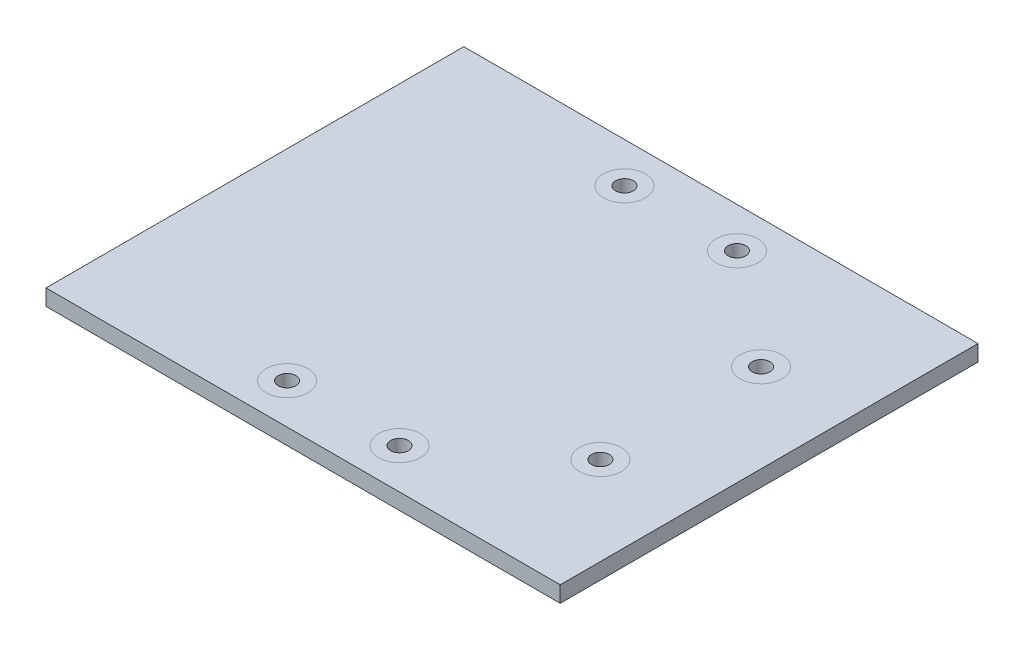
ISO-10303-21;
HEADER;
FILE_DESCRIPTION(('STEP AP214'),'2;1');
FILE_NAME('part.step','',(''),(''),'','','');
FILE_SCHEMA(('AUTOMOTIVE_DESIGN { 1 0 10303 214 1 1 1 1 }'));
ENDSEC;
DATA;
#1=APPLICATION_CONTEXT('core data for automotive mechanical design processes');
#2=APPLICATION_PROTOCOL_DEFINITION('international standard','automotive_design',2000,#1);
#3=PRODUCT_CONTEXT('',#1,'mechanical');
#4=PRODUCT('Part','Part','',(#3));
#5=PRODUCT_RELATED_PRODUCT_CATEGORY('part','',(#4));
#6=PRODUCT_DEFINITION_FORMATION('','',#4);
#7=PRODUCT_DEFINITION_CONTEXT('part definition',#1,'design');
#8=PRODUCT_DEFINITION('design','',#6,#7);
#9=PRODUCT_DEFINITION_SHAPE('','',#8);
#10=(LENGTH_UNIT() NAMED_UNIT(*) SI_UNIT(.MILLI.,.METRE.));
#11=(NAMED_UNIT(*) PLANE_ANGLE_UNIT() SI_UNIT($,.RADIAN.));
#12=(NAMED_UNIT(*) SI_UNIT($,.STERADIAN.) SOLID_ANGLE_UNIT());
#13=UNCERTAINTY_MEASURE_WITH_UNIT(LENGTH_MEASURE(1.E-05),#10,'distance_accuracy_value','');
#14=(GEOMETRIC_REPRESENTATION_CONTEXT(3) GLOBAL_UNCERTAINTY_ASSIGNED_CONTEXT((#13)) GLOBAL_UNIT_ASSIGNED_CONTEXT((#10,
#11,#12)) REPRESENTATION_CONTEXT('',''));
#15=CARTESIAN_POINT('',(0.,0.,0.));
#16=DIRECTION('',(0.,0.,1.));
#17=DIRECTION('',(1.,0.,0.));
#18=AXIS2_PLACEMENT_3D('',#15,#16,#17);
#19=CARTESIAN_POINT('',(16.4933920704846,0.,-34.0264317180617));
#20=DIRECTION('',(0.,1.,0.));
#21=DIRECTION('',(0.,0.,1.));
#22=AXIS2_PLACEMENT_3D('',#19,#20,#21);
#23=PLANE('',#22);
#24=CARTESIAN_POINT('',(53.,0.,-36.));
#25=DIRECTION('',(0.,1.,0.));
#26=DIRECTION('',(0.,0.,1.));
#27=AXIS2_PLACEMENT_3D('',#24,#25,#26);
#28=CIRCLE('',#27,2.6);
#29=CARTESIAN_POINT('',(53.,0.,-33.4));
#30=VERTEX_POINT('',#29);
#31=EDGE_CURVE('E150',#30,#30,#28,.F.);
#32=ORIENTED_EDGE('',*,*,#31,.T.);
#33=EDGE_LOOP('',(#32));
#34=FACE_BOUND('',#33,.T.);
#35=CARTESIAN_POINT('',(25.,0.,-47.));
#36=DIRECTION('',(0.,1.,0.));
#37=DIRECTION('',(0.,0.,1.));
#38=AXIS2_PLACEMENT_3D('',#35,#36,#37);
#39=CIRCLE('',#38,2.59999999999999);
#40=CARTESIAN_POINT('',(25.,0.,-44.4));
#41=VERTEX_POINT('',#40);
#42=EDGE_CURVE('E134',#41,#41,#39,.F.);
#43=ORIENTED_EDGE('',*,*,#42,.T.);
#44=EDGE_LOOP('',(#43));
#45=FACE_BOUND('',#44,.T.);
#46=CARTESIAN_POINT('',(39.,0.,-5.));
#47=DIRECTION('',(0.,1.,0.));
#48=DIRECTION('',(0.,0.,1.));
#49=AXIS2_PLACEMENT_3D('',#46,#47,#48);
#50=CIRCLE('',#49,2.6);
#51=CARTESIAN_POINT('',(39.,0.,-2.4));
#52=VERTEX_POINT('',#51);
#53=EDGE_CURVE('E118',#52,#52,#50,.F.);
#54=ORIENTED_EDGE('',*,*,#53,.T.);
#55=EDGE_LOOP('',(#54));
#56=FACE_BOUND('',#55,.T.);
#57=DIRECTION('',(0.,0.,1.));
#58=VECTOR('',#57,1.);
#59=CARTESIAN_POINT('',(0.,0.,-52.));
#60=LINE('',#59,#58);
#61=CARTESIAN_POINT('',(0.,0.,-52.));
#62=VERTEX_POINT('',#61);
#63=CARTESIAN_POINT('',(0.,0.,0.));
#64=VERTEX_POINT('',#63);
#65=EDGE_CURVE('E92',#62,#64,#60,.T.);
#66=ORIENTED_EDGE('',*,*,#65,.T.);
#67=DIRECTION('',(1.,0.,0.));
#68=VECTOR('',#67,1.);
#69=CARTESIAN_POINT('',(0.,0.,0.));
#70=LINE('',#69,#68);
#71=CARTESIAN_POINT('',(64.,0.,0.));
#72=VERTEX_POINT('',#71);
#73=EDGE_CURVE('E87',#64,#72,#70,.T.);
#74=ORIENTED_EDGE('',*,*,#73,.T.);
#75=DIRECTION('',(0.,0.,-1.));
#76=VECTOR('',#75,1.);
#77=CARTESIAN_POINT('',(64.,0.,-52.));
#78=LINE('',#77,#76);
#79=CARTESIAN_POINT('',(64.,0.,-52.));
#80=VERTEX_POINT('',#79);
#81=EDGE_CURVE('E90',#72,#80,#78,.T.);
#82=ORIENTED_EDGE('',*,*,#81,.T.);
#83=DIRECTION('',(-1.,0.,0.));
#84=VECTOR('',#83,1.);
#85=CARTESIAN_POINT('',(0.,0.,-52.));
#86=LINE('',#85,#84);
#87=EDGE_CURVE('E56',#80,#62,#86,.T.);
#88=ORIENTED_EDGE('',*,*,#87,.T.);
#89=EDGE_LOOP('',(#66,#74,#82,#88));
#90=FACE_BOUND('',#89,.T.);
#91=CARTESIAN_POINT('',(25.,0.,-5.));
#92=DIRECTION('',(0.,1.,0.));
#93=DIRECTION('',(0.,0.,1.));
#94=AXIS2_PLACEMENT_3D('',#91,#92,#93);
#95=CIRCLE('',#94,2.6);
#96=CARTESIAN_POINT('',(25.,0.,-2.4));
#97=VERTEX_POINT('',#96);
#98=EDGE_CURVE('E126',#97,#97,#95,.F.);
#99=ORIENTED_EDGE('',*,*,#98,.T.);
#100=EDGE_LOOP('',(#99));
#101=FACE_BOUND('',#100,.T.);
#102=CARTESIAN_POINT('',(39.,0.,-47.));
#103=DIRECTION('',(0.,1.,0.));
#104=DIRECTION('',(0.,0.,1.));
#105=AXIS2_PLACEMENT_3D('',#102,#103,#104);
#106=CIRCLE('',#105,2.6);
#107=CARTESIAN_POINT('',(39.,0.,-44.4));
#108=VERTEX_POINT('',#107);
#109=EDGE_CURVE('E142',#108,#108,#106,.F.);
#110=ORIENTED_EDGE('',*,*,#109,.T.);
#111=EDGE_LOOP('',(#110));
#112=FACE_BOUND('',#111,.T.);
#113=CARTESIAN_POINT('',(53.,0.,-16.));
#114=DIRECTION('',(0.,1.,0.));
#115=DIRECTION('',(0.,0.,1.));
#116=AXIS2_PLACEMENT_3D('',#113,#114,#115);
#117=CIRCLE('',#116,2.6);
#118=CARTESIAN_POINT('',(53.,0.,-13.4));
#119=VERTEX_POINT('',#118);
#120=EDGE_CURVE('E11',#119,#119,#117,.F.);
#121=ORIENTED_EDGE('',*,*,#120,.T.);
#122=EDGE_LOOP('',(#121));
#123=FACE_BOUND('',#122,.T.);
#124=ADVANCED_FACE('F38',(#34,#45,#56,#90,#101,#112,#123),#23,.T.);
#125=CARTESIAN_POINT('',(16.4933920704846,-2.,-34.0264317180617));
#126=DIRECTION('',(0.,1.,0.));
#127=DIRECTION('',(0.,0.,1.));
#128=AXIS2_PLACEMENT_3D('',#125,#126,#127);
#129=PLANE('',#128);
#130=CARTESIAN_POINT('',(53.,-2.,-36.));
#131=DIRECTION('',(0.,1.,0.));
#132=DIRECTION('',(0.,0.,1.));
#133=AXIS2_PLACEMENT_3D('',#130,#131,#132);
#134=CIRCLE('',#133,2.6);
#135=CARTESIAN_POINT('',(53.,-2.,-33.4));
#136=VERTEX_POINT('',#135);
#137=EDGE_CURVE('E146',#136,#136,#134,.F.);
#138=ORIENTED_EDGE('',*,*,#137,.F.);
#139=EDGE_LOOP('',(#138));
#140=FACE_BOUND('',#139,.T.);
#141=CARTESIAN_POINT('',(25.,-2.,-47.));
#142=DIRECTION('',(0.,1.,0.));
#143=DIRECTION('',(0.,0.,1.));
#144=AXIS2_PLACEMENT_3D('',#141,#142,#143);
#145=CIRCLE('',#144,2.59999999999999);
#146=CARTESIAN_POINT('',(25.,-2.,-44.4));
#147=VERTEX_POINT('',#146);
#148=EDGE_CURVE('E130',#147,#147,#145,.F.);
#149=ORIENTED_EDGE('',*,*,#148,.F.);
#150=EDGE_LOOP('',(#149));
#151=FACE_BOUND('',#150,.T.);
#152=CARTESIAN_POINT('',(39.,-2.,-5.));
#153=DIRECTION('',(0.,1.,0.));
#154=DIRECTION('',(0.,0.,1.));
#155=AXIS2_PLACEMENT_3D('',#152,#153,#154);
#156=CIRCLE('',#155,2.6);
#157=CARTESIAN_POINT('',(39.,-2.,-2.4));
#158=VERTEX_POINT('',#157);
#159=EDGE_CURVE('E117',#158,#158,#156,.F.);
#160=ORIENTED_EDGE('',*,*,#159,.F.);
#161=EDGE_LOOP('',(#160));
#162=FACE_BOUND('',#161,.T.);
#163=DIRECTION('',(0.,0.,1.));
#164=VECTOR('',#163,1.);
#165=CARTESIAN_POINT('',(0.,-2.,-52.));
#166=LINE('',#165,#164);
#167=CARTESIAN_POINT('',(0.,-2.,-52.));
#168=VERTEX_POINT('',#167);
#169=CARTESIAN_POINT('',(0.,-2.,0.));
#170=VERTEX_POINT('',#169);
#171=EDGE_CURVE('E107',#168,#170,#166,.T.);
#172=ORIENTED_EDGE('',*,*,#171,.F.);
#173=DIRECTION('',(-1.,0.,0.));
#174=VECTOR('',#173,1.);
#175=CARTESIAN_POINT('',(0.,-2.,-52.));
#176=LINE('',#175,#174);
#177=CARTESIAN_POINT('',(64.,-2.,-52.));
#178=VERTEX_POINT('',#177);
#179=EDGE_CURVE('E79',#178,#168,#176,.T.);
#180=ORIENTED_EDGE('',*,*,#179,.F.);
#181=DIRECTION('',(0.,0.,-1.));
#182=VECTOR('',#181,1.);
#183=CARTESIAN_POINT('',(64.,-2.,-52.));
#184=LINE('',#183,#182);
#185=CARTESIAN_POINT('',(64.,-2.,0.));
#186=VERTEX_POINT('',#185);
#187=EDGE_CURVE('E73',#186,#178,#184,.T.);
#188=ORIENTED_EDGE('',*,*,#187,.F.);
#189=DIRECTION('',(1.,0.,0.));
#190=VECTOR('',#189,1.);
#191=CARTESIAN_POINT('',(0.,-2.,0.));
#192=LINE('',#191,#190);
#193=EDGE_CURVE('E97',#170,#186,#192,.T.);
#194=ORIENTED_EDGE('',*,*,#193,.F.);
#195=EDGE_LOOP('',(#172,#180,#188,#194));
#196=FACE_BOUND('',#195,.T.);
#197=CARTESIAN_POINT('',(25.,-2.,-5.));
#198=DIRECTION('',(0.,1.,0.));
#199=DIRECTION('',(0.,0.,1.));
#200=AXIS2_PLACEMENT_3D('',#197,#198,#199);
#201=CIRCLE('',#200,2.6);
#202=CARTESIAN_POINT('',(25.,-2.,-2.4));
#203=VERTEX_POINT('',#202);
#204=EDGE_CURVE('E122',#203,#203,#201,.F.);
#205=ORIENTED_EDGE('',*,*,#204,.F.);
#206=EDGE_LOOP('',(#205));
#207=FACE_BOUND('',#206,.T.);
#208=CARTESIAN_POINT('',(39.,-2.,-47.));
#209=DIRECTION('',(0.,1.,0.));
#210=DIRECTION('',(0.,0.,1.));
#211=AXIS2_PLACEMENT_3D('',#208,#209,#210);
#212=CIRCLE('',#211,2.6);
#213=CARTESIAN_POINT('',(39.,-2.,-44.4));
#214=VERTEX_POINT('',#213);
#215=EDGE_CURVE('E138',#214,#214,#212,.F.);
#216=ORIENTED_EDGE('',*,*,#215,.F.);
#217=EDGE_LOOP('',(#216));
#218=FACE_BOUND('',#217,.T.);
#219=CARTESIAN_POINT('',(53.,-2.,-16.));
#220=DIRECTION('',(0.,1.,0.));
#221=DIRECTION('',(0.,0.,1.));
#222=AXIS2_PLACEMENT_3D('',#219,#220,#221);
#223=CIRCLE('',#222,2.6);
#224=CARTESIAN_POINT('',(53.,-2.,-13.4));
#225=VERTEX_POINT('',#224);
#226=EDGE_CURVE('E42',#225,#225,#223,.F.);
#227=ORIENTED_EDGE('',*,*,#226,.F.);
#228=EDGE_LOOP('',(#227));
#229=FACE_BOUND('',#228,.T.);
#230=ADVANCED_FACE('F163',(#140,#151,#162,#196,#207,#218,#229),#129,.F.);
#231=ORIENTED_EDGE('',*,*,#120,.F.);
#232=EDGE_LOOP('',(#231));
#233=FACE_BOUND('',#232,.T.);
#234=CARTESIAN_POINT('',(53.,0.,-16.));
#235=DIRECTION('',(0.,1.,0.));
#236=DIRECTION('',(0.,0.,1.));
#237=AXIS2_PLACEMENT_3D('',#234,#235,#236);
#238=CIRCLE('',#237,1.1);
#239=CARTESIAN_POINT('',(53.,0.,-14.9));
#240=VERTEX_POINT('',#239);
#241=EDGE_CURVE('E198',#240,#240,#238,.T.);
#242=ORIENTED_EDGE('',*,*,#241,.F.);
#243=EDGE_LOOP('',(#242));
#244=FACE_BOUND('',#243,.T.);
#245=ADVANCED_FACE('F166',(#233,#244),#23,.T.);
#246=ORIENTED_EDGE('',*,*,#226,.T.);
#247=EDGE_LOOP('',(#246));
#248=FACE_BOUND('',#247,.T.);
#249=CARTESIAN_POINT('',(53.,-2.,-16.));
#250=DIRECTION('',(0.,1.,0.));
#251=DIRECTION('',(0.,0.,1.));
#252=AXIS2_PLACEMENT_3D('',#249,#250,#251);
#253=CIRCLE('',#252,1.1);
#254=CARTESIAN_POINT('',(53.,-2.,-14.9));
#255=VERTEX_POINT('',#254);
#256=EDGE_CURVE('E195',#255,#255,#253,.T.);
#257=ORIENTED_EDGE('',*,*,#256,.T.);
#258=EDGE_LOOP('',(#257));
#259=FACE_BOUND('',#258,.T.);
#260=ADVANCED_FACE('F168',(#248,#259),#129,.F.);
#261=ORIENTED_EDGE('',*,*,#31,.F.);
#262=EDGE_LOOP('',(#261));
#263=FACE_BOUND('',#262,.T.);
#264=CARTESIAN_POINT('',(53.,0.,-36.));
#265=DIRECTION('',(0.,1.,0.));
#266=DIRECTION('',(0.,0.,1.));
#267=AXIS2_PLACEMENT_3D('',#264,#265,#266);
#268=CIRCLE('',#267,1.1);
#269=CARTESIAN_POINT('',(53.,0.,-34.9));
#270=VERTEX_POINT('',#269);
#271=EDGE_CURVE('E280',#270,#270,#268,.T.);
#272=ORIENTED_EDGE('',*,*,#271,.F.);
#273=EDGE_LOOP('',(#272));
#274=FACE_BOUND('',#273,.T.);
#275=ADVANCED_FACE('F192',(#263,#274),#23,.T.);
#276=ORIENTED_EDGE('',*,*,#137,.T.);
#277=EDGE_LOOP('',(#276));
#278=FACE_BOUND('',#277,.T.);
#279=CARTESIAN_POINT('',(53.,-2.,-36.));
#280=DIRECTION('',(0.,1.,0.));
#281=DIRECTION('',(0.,0.,1.));
#282=AXIS2_PLACEMENT_3D('',#279,#280,#281);
#283=CIRCLE('',#282,1.1);
#284=CARTESIAN_POINT('',(53.,-2.,-34.9));
#285=VERTEX_POINT('',#284);
#286=EDGE_CURVE('E204',#285,#285,#283,.T.);
#287=ORIENTED_EDGE('',*,*,#286,.T.);
#288=EDGE_LOOP('',(#287));
#289=FACE_BOUND('',#288,.T.);
#290=ADVANCED_FACE('F160',(#278,#289),#129,.F.);
#291=ORIENTED_EDGE('',*,*,#109,.F.);
#292=EDGE_LOOP('',(#291));
#293=FACE_BOUND('',#292,.T.);
#294=CARTESIAN_POINT('',(39.,0.,-47.));
#295=DIRECTION('',(0.,1.,0.));
#296=DIRECTION('',(0.,0.,1.));
#297=AXIS2_PLACEMENT_3D('',#294,#295,#296);
#298=CIRCLE('',#297,1.1);
#299=CARTESIAN_POINT('',(39.,0.,-45.9));
#300=VERTEX_POINT('',#299);
#301=EDGE_CURVE('E274',#300,#300,#298,.T.);
#302=ORIENTED_EDGE('',*,*,#301,.F.);
#303=EDGE_LOOP('',(#302));
#304=FACE_BOUND('',#303,.T.);
#305=ADVANCED_FACE('F245',(#293,#304),#23,.T.);
#306=ORIENTED_EDGE('',*,*,#215,.T.);
#307=EDGE_LOOP('',(#306));
#308=FACE_BOUND('',#307,.T.);
#309=CARTESIAN_POINT('',(39.,-2.,-47.));
#310=DIRECTION('',(0.,1.,0.));
#311=DIRECTION('',(0.,0.,1.));
#312=AXIS2_PLACEMENT_3D('',#309,#310,#311);
#313=CIRCLE('',#312,1.1);
#314=CARTESIAN_POINT('',(39.,-2.,-45.9));
#315=VERTEX_POINT('',#314);
#316=EDGE_CURVE('E276',#315,#315,#313,.T.);
#317=ORIENTED_EDGE('',*,*,#316,.T.);
#318=EDGE_LOOP('',(#317));
#319=FACE_BOUND('',#318,.T.);
#320=ADVANCED_FACE('F238',(#308,#319),#129,.F.);
#321=ORIENTED_EDGE('',*,*,#42,.F.);
#322=EDGE_LOOP('',(#321));
#323=FACE_BOUND('',#322,.T.);
#324=CARTESIAN_POINT('',(25.,0.,-47.));
#325=DIRECTION('',(0.,1.,0.));
#326=DIRECTION('',(0.,0.,1.));
#327=AXIS2_PLACEMENT_3D('',#324,#325,#326);
#328=CIRCLE('',#327,1.1);
#329=CARTESIAN_POINT('',(25.,0.,-45.9));
#330=VERTEX_POINT('',#329);
#331=EDGE_CURVE('E283',#330,#330,#328,.T.);
#332=ORIENTED_EDGE('',*,*,#331,.F.);
#333=EDGE_LOOP('',(#332));
#334=FACE_BOUND('',#333,.T.);
#335=ADVANCED_FACE('F231',(#323,#334),#23,.T.);
#336=ORIENTED_EDGE('',*,*,#148,.T.);
#337=EDGE_LOOP('',(#336));
#338=FACE_BOUND('',#337,.T.);
#339=CARTESIAN_POINT('',(25.,-2.,-47.));
#340=DIRECTION('',(0.,1.,0.));
#341=DIRECTION('',(0.,0.,1.));
#342=AXIS2_PLACEMENT_3D('',#339,#340,#341);
#343=CIRCLE('',#342,1.1);
#344=CARTESIAN_POINT('',(25.,-2.,-45.9));
#345=VERTEX_POINT('',#344);
#346=EDGE_CURVE('E277',#345,#345,#343,.T.);
#347=ORIENTED_EDGE('',*,*,#346,.T.);
#348=EDGE_LOOP('',(#347));
#349=FACE_BOUND('',#348,.T.);
#350=ADVANCED_FACE('F227',(#338,#349),#129,.F.);
#351=ORIENTED_EDGE('',*,*,#98,.F.);
#352=EDGE_LOOP('',(#351));
#353=FACE_BOUND('',#352,.T.);
#354=CARTESIAN_POINT('',(25.,0.,-5.));
#355=DIRECTION('',(0.,1.,0.));
#356=DIRECTION('',(0.,0.,1.));
#357=AXIS2_PLACEMENT_3D('',#354,#355,#356);
#358=CIRCLE('',#357,1.1);
#359=CARTESIAN_POINT('',(25.,0.,-3.9));
#360=VERTEX_POINT('',#359);
#361=EDGE_CURVE('E210',#360,#360,#358,.T.);
#362=ORIENTED_EDGE('',*,*,#361,.F.);
#363=EDGE_LOOP('',(#362));
#364=FACE_BOUND('',#363,.T.);
#365=ADVANCED_FACE('F225',(#353,#364),#23,.T.);
#366=ORIENTED_EDGE('',*,*,#204,.T.);
#367=EDGE_LOOP('',(#366));
#368=FACE_BOUND('',#367,.T.);
#369=CARTESIAN_POINT('',(25.,-2.,-5.));
#370=DIRECTION('',(0.,1.,0.));
#371=DIRECTION('',(0.,0.,1.));
#372=AXIS2_PLACEMENT_3D('',#369,#370,#371);
#373=CIRCLE('',#372,1.1);
#374=CARTESIAN_POINT('',(25.,-2.,-3.9));
#375=VERTEX_POINT('',#374);
#376=EDGE_CURVE('E110',#375,#375,#373,.T.);
#377=ORIENTED_EDGE('',*,*,#376,.T.);
#378=EDGE_LOOP('',(#377));
#379=FACE_BOUND('',#378,.T.);
#380=ADVANCED_FACE('F216',(#368,#379),#129,.F.);
#381=CARTESIAN_POINT('',(0.,0.,-52.));
#382=DIRECTION('',(1.,0.,0.));
#383=DIRECTION('',(0.,0.,-1.));
#384=AXIS2_PLACEMENT_3D('',#381,#382,#383);
#385=PLANE('',#384);
#386=ORIENTED_EDGE('',*,*,#171,.T.);
#387=DIRECTION('',(0.,-1.,0.));
#388=VECTOR('',#387,1.);
#389=CARTESIAN_POINT('',(0.,0.,0.));
#390=LINE('',#389,#388);
#391=EDGE_CURVE('E98',#64,#170,#390,.T.);
#392=ORIENTED_EDGE('',*,*,#391,.F.);
#393=ORIENTED_EDGE('',*,*,#65,.F.);
#394=DIRECTION('',(0.,-1.,0.));
#395=VECTOR('',#394,1.);
#396=CARTESIAN_POINT('',(0.,0.,-52.));
#397=LINE('',#396,#395);
#398=EDGE_CURVE('E103',#62,#168,#397,.T.);
#399=ORIENTED_EDGE('',*,*,#398,.T.);
#400=EDGE_LOOP('',(#386,#392,#393,#399));
#401=FACE_BOUND('',#400,.T.);
#402=ADVANCED_FACE('F40',(#401),#385,.F.);
#403=CARTESIAN_POINT('',(0.,0.,0.));
#404=DIRECTION('',(0.,0.,-1.));
#405=DIRECTION('',(-1.,0.,0.));
#406=AXIS2_PLACEMENT_3D('',#403,#404,#405);
#407=PLANE('',#406);
#408=ORIENTED_EDGE('',*,*,#193,.T.);
#409=DIRECTION('',(0.,-1.,0.));
#410=VECTOR('',#409,1.);
#411=CARTESIAN_POINT('',(64.,0.,0.));
#412=LINE('',#411,#410);
#413=EDGE_CURVE('E95',#72,#186,#412,.T.);
#414=ORIENTED_EDGE('',*,*,#413,.F.);
#415=ORIENTED_EDGE('',*,*,#73,.F.);
#416=ORIENTED_EDGE('',*,*,#391,.T.);
#417=EDGE_LOOP('',(#408,#414,#415,#416));
#418=FACE_BOUND('',#417,.T.);
#419=ADVANCED_FACE('F96',(#418),#407,.F.);
#420=CARTESIAN_POINT('',(64.,0.,-52.));
#421=DIRECTION('',(-1.,0.,0.));
#422=DIRECTION('',(0.,0.,1.));
#423=AXIS2_PLACEMENT_3D('',#420,#421,#422);
#424=PLANE('',#423);
#425=ORIENTED_EDGE('',*,*,#187,.T.);
#426=DIRECTION('',(0.,-1.,0.));
#427=VECTOR('',#426,1.);
#428=CARTESIAN_POINT('',(64.,0.,-52.));
#429=LINE('',#428,#427);
#430=EDGE_CURVE('E99',#80,#178,#429,.T.);
#431=ORIENTED_EDGE('',*,*,#430,.F.);
#432=ORIENTED_EDGE('',*,*,#81,.F.);
#433=ORIENTED_EDGE('',*,*,#413,.T.);
#434=EDGE_LOOP('',(#425,#431,#432,#433));
#435=FACE_BOUND('',#434,.T.);
#436=ADVANCED_FACE('F101',(#435),#424,.F.);
#437=CARTESIAN_POINT('',(0.,0.,-52.));
#438=DIRECTION('',(0.,0.,1.));
#439=DIRECTION('',(1.,0.,0.));
#440=AXIS2_PLACEMENT_3D('',#437,#438,#439);
#441=PLANE('',#440);
#442=ORIENTED_EDGE('',*,*,#179,.T.);
#443=ORIENTED_EDGE('',*,*,#398,.F.);
#444=ORIENTED_EDGE('',*,*,#87,.F.);
#445=ORIENTED_EDGE('',*,*,#430,.T.);
#446=EDGE_LOOP('',(#442,#443,#444,#445));
#447=FACE_BOUND('',#446,.T.);
#448=ADVANCED_FACE('F241',(#447),#441,.F.);
#449=ORIENTED_EDGE('',*,*,#53,.F.);
#450=EDGE_LOOP('',(#449));
#451=FACE_BOUND('',#450,.T.);
#452=CARTESIAN_POINT('',(39.,0.,-5.));
#453=DIRECTION('',(0.,1.,0.));
#454=DIRECTION('',(0.,0.,1.));
#455=AXIS2_PLACEMENT_3D('',#452,#453,#454);
#456=CIRCLE('',#455,1.1);
#457=CARTESIAN_POINT('',(39.,0.,-3.9));
#458=VERTEX_POINT('',#457);
#459=EDGE_CURVE('E197',#458,#458,#456,.T.);
#460=ORIENTED_EDGE('',*,*,#459,.F.);
#461=EDGE_LOOP('',(#460));
#462=FACE_BOUND('',#461,.T.);
#463=ADVANCED_FACE('F230',(#451,#462),#23,.T.);
#464=ORIENTED_EDGE('',*,*,#159,.T.);
#465=EDGE_LOOP('',(#464));
#466=FACE_BOUND('',#465,.T.);
#467=CARTESIAN_POINT('',(39.,-2.,-5.));
#468=DIRECTION('',(0.,1.,0.));
#469=DIRECTION('',(0.,0.,1.));
#470=AXIS2_PLACEMENT_3D('',#467,#468,#469);
#471=CIRCLE('',#470,1.1);
#472=CARTESIAN_POINT('',(39.,-2.,-3.9));
#473=VERTEX_POINT('',#472);
#474=EDGE_CURVE('E201',#473,#473,#471,.T.);
#475=ORIENTED_EDGE('',*,*,#474,.T.);
#476=EDGE_LOOP('',(#475));
#477=FACE_BOUND('',#476,.T.);
#478=ADVANCED_FACE('F169',(#466,#477),#129,.F.);
#479=CARTESIAN_POINT('',(25.,0.,-5.));
#480=DIRECTION('',(0.,1.,0.));
#481=DIRECTION('',(0.,0.,1.));
#482=AXIS2_PLACEMENT_3D('',#479,#480,#481);
#483=CYLINDRICAL_SURFACE('',#482,1.1);
#484=ORIENTED_EDGE('',*,*,#376,.F.);
#485=EDGE_LOOP('',(#484));
#486=FACE_BOUND('',#485,.T.);
#487=ORIENTED_EDGE('',*,*,#361,.T.);
#488=EDGE_LOOP('',(#487));
#489=FACE_BOUND('',#488,.T.);
#490=ADVANCED_FACE('F218',(#486,#489),#483,.F.);
#491=CARTESIAN_POINT('',(39.,0.,-5.));
#492=DIRECTION('',(0.,1.,0.));
#493=DIRECTION('',(0.,0.,1.));
#494=AXIS2_PLACEMENT_3D('',#491,#492,#493);
#495=CYLINDRICAL_SURFACE('',#494,1.1);
#496=ORIENTED_EDGE('',*,*,#474,.F.);
#497=EDGE_LOOP('',(#496));
#498=FACE_BOUND('',#497,.T.);
#499=ORIENTED_EDGE('',*,*,#459,.T.);
#500=EDGE_LOOP('',(#499));
#501=FACE_BOUND('',#500,.T.);
#502=ADVANCED_FACE('F221',(#498,#501),#495,.F.);
#503=CARTESIAN_POINT('',(53.,0.,-16.));
#504=DIRECTION('',(0.,1.,0.));
#505=DIRECTION('',(0.,0.,1.));
#506=AXIS2_PLACEMENT_3D('',#503,#504,#505);
#507=CYLINDRICAL_SURFACE('',#506,1.1);
#508=ORIENTED_EDGE('',*,*,#256,.F.);
#509=EDGE_LOOP('',(#508));
#510=FACE_BOUND('',#509,.T.);
#511=ORIENTED_EDGE('',*,*,#241,.T.);
#512=EDGE_LOOP('',(#511));
#513=FACE_BOUND('',#512,.T.);
#514=ADVANCED_FACE('F295',(#510,#513),#507,.F.);
#515=CARTESIAN_POINT('',(53.,0.,-36.));
#516=DIRECTION('',(0.,1.,0.));
#517=DIRECTION('',(0.,0.,1.));
#518=AXIS2_PLACEMENT_3D('',#515,#516,#517);
#519=CYLINDRICAL_SURFACE('',#518,1.1);
#520=ORIENTED_EDGE('',*,*,#286,.F.);
#521=EDGE_LOOP('',(#520));
#522=FACE_BOUND('',#521,.T.);
#523=ORIENTED_EDGE('',*,*,#271,.T.);
#524=EDGE_LOOP('',(#523));
#525=FACE_BOUND('',#524,.T.);
#526=ADVANCED_FACE('F291',(#522,#525),#519,.F.);
#527=CARTESIAN_POINT('',(39.,0.,-47.));
#528=DIRECTION('',(0.,1.,0.));
#529=DIRECTION('',(0.,0.,1.));
#530=AXIS2_PLACEMENT_3D('',#527,#528,#529);
#531=CYLINDRICAL_SURFACE('',#530,1.1);
#532=ORIENTED_EDGE('',*,*,#316,.F.);
#533=EDGE_LOOP('',(#532));
#534=FACE_BOUND('',#533,.T.);
#535=ORIENTED_EDGE('',*,*,#301,.T.);
#536=EDGE_LOOP('',(#535));
#537=FACE_BOUND('',#536,.T.);
#538=ADVANCED_FACE('F294',(#534,#537),#531,.F.);
#539=CARTESIAN_POINT('',(25.,0.,-47.));
#540=DIRECTION('',(0.,1.,0.));
#541=DIRECTION('',(0.,0.,1.));
#542=AXIS2_PLACEMENT_3D('',#539,#540,#541);
#543=CYLINDRICAL_SURFACE('',#542,1.1);
#544=ORIENTED_EDGE('',*,*,#346,.F.);
#545=EDGE_LOOP('',(#544));
#546=FACE_BOUND('',#545,.T.);
#547=ORIENTED_EDGE('',*,*,#331,.T.);
#548=EDGE_LOOP('',(#547));
#549=FACE_BOUND('',#548,.T.);
#550=ADVANCED_FACE('F302',(#546,#549),#543,.F.);
#551=CLOSED_SHELL('',(#124,#230,#245,#260,#275,#290,#305,#320,#335,#350,#365,#380,#402,#419,
#436,#448,#463,#478,#490,#502,#514,#526,#538,#550));
#552=MANIFOLD_SOLID_BREP('B2',#551);
#553=ADVANCED_BREP_SHAPE_REPRESENTATION('',(#18,#552),#14);
#554=SHAPE_DEFINITION_REPRESENTATION(#9,#553);
ENDSEC;
END-ISO-10303-21;
